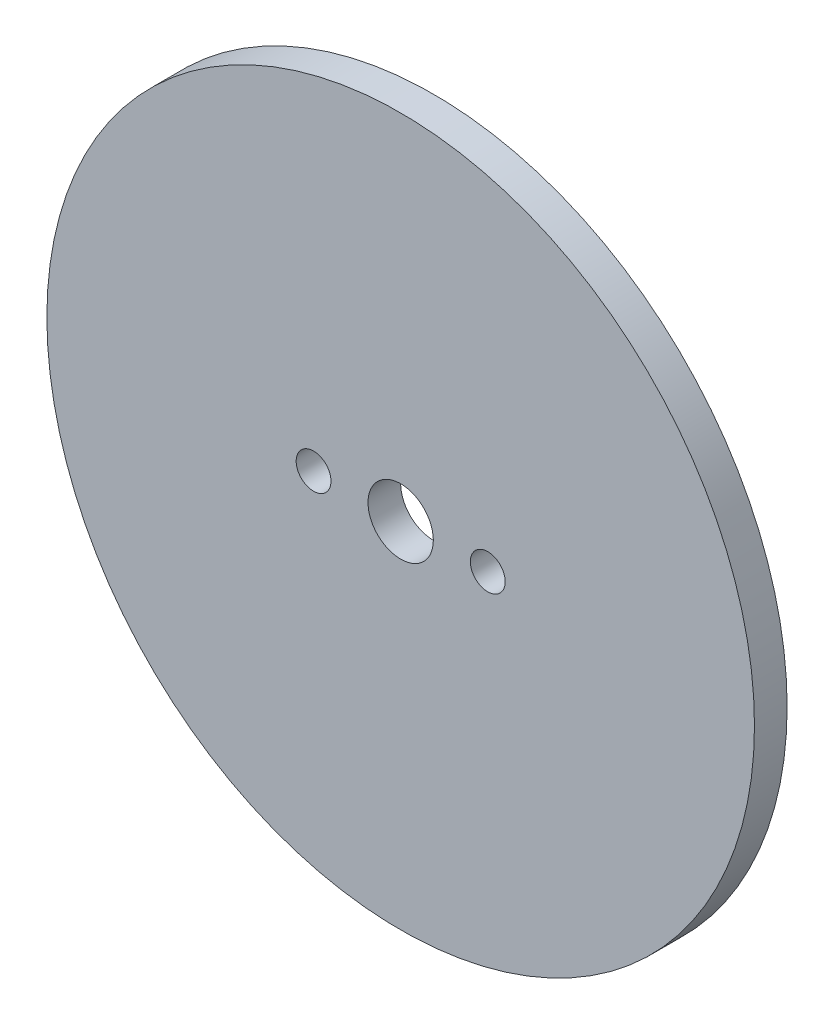
ISO-10303-21;
HEADER;
FILE_DESCRIPTION(('STEP AP214'),'2;1');
FILE_NAME('part.step','',(''),(''),'','','');
FILE_SCHEMA(('AUTOMOTIVE_DESIGN { 1 0 10303 214 1 1 1 1 }'));
ENDSEC;
DATA;
#1=APPLICATION_CONTEXT('core data for automotive mechanical design processes');
#2=APPLICATION_PROTOCOL_DEFINITION('international standard','automotive_design',2000,#1);
#3=PRODUCT_CONTEXT('',#1,'mechanical');
#4=PRODUCT('Part','Part','',(#3));
#5=PRODUCT_RELATED_PRODUCT_CATEGORY('part','',(#4));
#6=PRODUCT_DEFINITION_FORMATION('','',#4);
#7=PRODUCT_DEFINITION_CONTEXT('part definition',#1,'design');
#8=PRODUCT_DEFINITION('design','',#6,#7);
#9=PRODUCT_DEFINITION_SHAPE('','',#8);
#10=(LENGTH_UNIT() NAMED_UNIT(*) SI_UNIT(.MILLI.,.METRE.));
#11=(NAMED_UNIT(*) PLANE_ANGLE_UNIT() SI_UNIT($,.RADIAN.));
#12=(NAMED_UNIT(*) SI_UNIT($,.STERADIAN.) SOLID_ANGLE_UNIT());
#13=UNCERTAINTY_MEASURE_WITH_UNIT(LENGTH_MEASURE(1.E-05),#10,'distance_accuracy_value','');
#14=(GEOMETRIC_REPRESENTATION_CONTEXT(3) GLOBAL_UNCERTAINTY_ASSIGNED_CONTEXT((#13)) GLOBAL_UNIT_ASSIGNED_CONTEXT((#10,
#11,#12)) REPRESENTATION_CONTEXT('',''));
#15=CARTESIAN_POINT('',(0.,0.,0.));
#16=DIRECTION('',(0.,0.,1.));
#17=DIRECTION('',(1.,0.,0.));
#18=AXIS2_PLACEMENT_3D('',#15,#16,#17);
#19=CARTESIAN_POINT('',(0.,0.,1.5));
#20=DIRECTION('',(0.,0.,1.));
#21=DIRECTION('',(1.,0.,0.));
#22=AXIS2_PLACEMENT_3D('',#19,#20,#21);
#23=PLANE('',#22);
#24=CARTESIAN_POINT('',(-8.,0.,1.5));
#25=DIRECTION('',(0.,0.,1.));
#26=DIRECTION('',(1.,0.,0.));
#27=AXIS2_PLACEMENT_3D('',#24,#25,#26);
#28=CIRCLE('',#27,1.6);
#29=CARTESIAN_POINT('',(-6.4,0.,1.5));
#30=VERTEX_POINT('',#29);
#31=EDGE_CURVE('E46',#30,#30,#28,.T.);
#32=ORIENTED_EDGE('',*,*,#31,.F.);
#33=EDGE_LOOP('',(#32));
#34=FACE_BOUND('',#33,.T.);
#35=CARTESIAN_POINT('',(0.,0.,1.5));
#36=DIRECTION('',(0.,0.,1.));
#37=DIRECTION('',(1.,0.,0.));
#38=AXIS2_PLACEMENT_3D('',#35,#36,#37);
#39=CIRCLE('',#38,32.5);
#40=CARTESIAN_POINT('',(32.5,0.,1.5));
#41=VERTEX_POINT('',#40);
#42=EDGE_CURVE('E10',#41,#41,#39,.T.);
#43=ORIENTED_EDGE('',*,*,#42,.T.);
#44=EDGE_LOOP('',(#43));
#45=FACE_BOUND('',#44,.T.);
#46=CARTESIAN_POINT('',(0.,0.,1.5));
#47=DIRECTION('',(0.,0.,1.));
#48=DIRECTION('',(1.,0.,0.));
#49=AXIS2_PLACEMENT_3D('',#46,#47,#48);
#50=CIRCLE('',#49,3.);
#51=CARTESIAN_POINT('',(3.,0.,1.5));
#52=VERTEX_POINT('',#51);
#53=EDGE_CURVE('E41',#52,#52,#50,.T.);
#54=ORIENTED_EDGE('',*,*,#53,.F.);
#55=EDGE_LOOP('',(#54));
#56=FACE_BOUND('',#55,.T.);
#57=CARTESIAN_POINT('',(8.,0.,1.5));
#58=DIRECTION('',(0.,0.,1.));
#59=DIRECTION('',(1.,0.,0.));
#60=AXIS2_PLACEMENT_3D('',#57,#58,#59);
#61=CIRCLE('',#60,1.6);
#62=CARTESIAN_POINT('',(9.6,0.,1.5));
#63=VERTEX_POINT('',#62);
#64=EDGE_CURVE('E52',#63,#63,#61,.T.);
#65=ORIENTED_EDGE('',*,*,#64,.F.);
#66=EDGE_LOOP('',(#65));
#67=FACE_BOUND('',#66,.T.);
#68=ADVANCED_FACE('F30',(#34,#45,#56,#67),#23,.T.);
#69=CARTESIAN_POINT('',(0.,0.,-1.5));
#70=DIRECTION('',(0.,0.,1.));
#71=DIRECTION('',(1.,0.,0.));
#72=AXIS2_PLACEMENT_3D('',#69,#70,#71);
#73=PLANE('',#72);
#74=CARTESIAN_POINT('',(0.,0.,-1.5));
#75=DIRECTION('',(0.,0.,1.));
#76=DIRECTION('',(1.,0.,0.));
#77=AXIS2_PLACEMENT_3D('',#74,#75,#76);
#78=CIRCLE('',#77,32.5);
#79=CARTESIAN_POINT('',(32.5,0.,-1.5));
#80=VERTEX_POINT('',#79);
#81=EDGE_CURVE('E34',#80,#80,#78,.T.);
#82=ORIENTED_EDGE('',*,*,#81,.F.);
#83=EDGE_LOOP('',(#82));
#84=FACE_BOUND('',#83,.T.);
#85=CARTESIAN_POINT('',(0.,0.,-1.5));
#86=DIRECTION('',(0.,0.,1.));
#87=DIRECTION('',(1.,0.,0.));
#88=AXIS2_PLACEMENT_3D('',#85,#86,#87);
#89=CIRCLE('',#88,3.);
#90=CARTESIAN_POINT('',(3.,0.,-1.5));
#91=VERTEX_POINT('',#90);
#92=EDGE_CURVE('E43',#91,#91,#89,.T.);
#93=ORIENTED_EDGE('',*,*,#92,.T.);
#94=EDGE_LOOP('',(#93));
#95=FACE_BOUND('',#94,.T.);
#96=CARTESIAN_POINT('',(-8.,0.,-1.5));
#97=DIRECTION('',(0.,0.,1.));
#98=DIRECTION('',(1.,0.,0.));
#99=AXIS2_PLACEMENT_3D('',#96,#97,#98);
#100=CIRCLE('',#99,1.6);
#101=CARTESIAN_POINT('',(-6.4,0.,-1.5));
#102=VERTEX_POINT('',#101);
#103=EDGE_CURVE('E49',#102,#102,#100,.T.);
#104=ORIENTED_EDGE('',*,*,#103,.T.);
#105=EDGE_LOOP('',(#104));
#106=FACE_BOUND('',#105,.T.);
#107=CARTESIAN_POINT('',(8.,0.,-1.5));
#108=DIRECTION('',(0.,0.,1.));
#109=DIRECTION('',(1.,0.,0.));
#110=AXIS2_PLACEMENT_3D('',#107,#108,#109);
#111=CIRCLE('',#110,1.6);
#112=CARTESIAN_POINT('',(9.6,0.,-1.5));
#113=VERTEX_POINT('',#112);
#114=EDGE_CURVE('E55',#113,#113,#111,.T.);
#115=ORIENTED_EDGE('',*,*,#114,.T.);
#116=EDGE_LOOP('',(#115));
#117=FACE_BOUND('',#116,.T.);
#118=ADVANCED_FACE('F65',(#84,#95,#106,#117),#73,.F.);
#119=CARTESIAN_POINT('',(0.,0.,1.5));
#120=DIRECTION('',(0.,0.,-1.));
#121=DIRECTION('',(-1.,0.,0.));
#122=AXIS2_PLACEMENT_3D('',#119,#120,#121);
#123=CYLINDRICAL_SURFACE('',#122,32.5);
#124=ORIENTED_EDGE('',*,*,#42,.F.);
#125=EDGE_LOOP('',(#124));
#126=FACE_BOUND('',#125,.T.);
#127=ORIENTED_EDGE('',*,*,#81,.T.);
#128=EDGE_LOOP('',(#127));
#129=FACE_BOUND('',#128,.T.);
#130=ADVANCED_FACE('F32',(#126,#129),#123,.T.);
#131=CARTESIAN_POINT('',(0.,0.,1.5));
#132=DIRECTION('',(0.,0.,-1.));
#133=DIRECTION('',(-1.,0.,0.));
#134=AXIS2_PLACEMENT_3D('',#131,#132,#133);
#135=CYLINDRICAL_SURFACE('',#134,3.);
#136=ORIENTED_EDGE('',*,*,#53,.T.);
#137=EDGE_LOOP('',(#136));
#138=FACE_BOUND('',#137,.T.);
#139=ORIENTED_EDGE('',*,*,#92,.F.);
#140=EDGE_LOOP('',(#139));
#141=FACE_BOUND('',#140,.T.);
#142=ADVANCED_FACE('F74',(#138,#141),#135,.F.);
#143=CARTESIAN_POINT('',(-8.,0.,1.5));
#144=DIRECTION('',(0.,0.,-1.));
#145=DIRECTION('',(-1.,0.,0.));
#146=AXIS2_PLACEMENT_3D('',#143,#144,#145);
#147=CYLINDRICAL_SURFACE('',#146,1.6);
#148=ORIENTED_EDGE('',*,*,#31,.T.);
#149=EDGE_LOOP('',(#148));
#150=FACE_BOUND('',#149,.T.);
#151=ORIENTED_EDGE('',*,*,#103,.F.);
#152=EDGE_LOOP('',(#151));
#153=FACE_BOUND('',#152,.T.);
#154=ADVANCED_FACE('F77',(#150,#153),#147,.F.);
#155=CARTESIAN_POINT('',(8.,0.,1.5));
#156=DIRECTION('',(0.,0.,-1.));
#157=DIRECTION('',(-1.,0.,0.));
#158=AXIS2_PLACEMENT_3D('',#155,#156,#157);
#159=CYLINDRICAL_SURFACE('',#158,1.6);
#160=ORIENTED_EDGE('',*,*,#64,.T.);
#161=EDGE_LOOP('',(#160));
#162=FACE_BOUND('',#161,.T.);
#163=ORIENTED_EDGE('',*,*,#114,.F.);
#164=EDGE_LOOP('',(#163));
#165=FACE_BOUND('',#164,.T.);
#166=ADVANCED_FACE('F61',(#162,#165),#159,.F.);
#167=CLOSED_SHELL('',(#68,#118,#130,#142,#154,#166));
#168=MANIFOLD_SOLID_BREP('B2',#167);
#169=ADVANCED_BREP_SHAPE_REPRESENTATION('',(#18,#168),#14);
#170=SHAPE_DEFINITION_REPRESENTATION(#9,#169);
ENDSEC;
END-ISO-10303-21;
